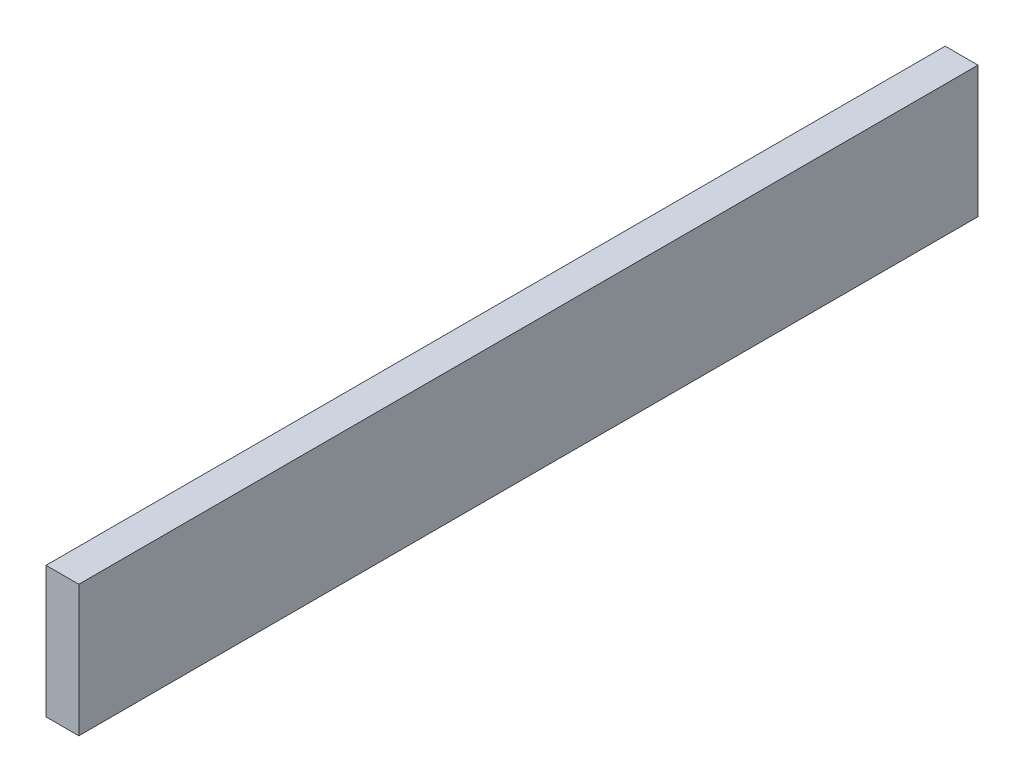
ISO-10303-21;
HEADER;
FILE_DESCRIPTION(('STEP AP214'),'2;1');
FILE_NAME('part.step','',(''),(''),'','','');
FILE_SCHEMA(('AUTOMOTIVE_DESIGN { 1 0 10303 214 1 1 1 1 }'));
ENDSEC;
DATA;
#1=APPLICATION_CONTEXT('core data for automotive mechanical design processes');
#2=APPLICATION_PROTOCOL_DEFINITION('international standard','automotive_design',2000,#1);
#3=PRODUCT_CONTEXT('',#1,'mechanical');
#4=PRODUCT('Part','Part','',(#3));
#5=PRODUCT_RELATED_PRODUCT_CATEGORY('part','',(#4));
#6=PRODUCT_DEFINITION_FORMATION('','',#4);
#7=PRODUCT_DEFINITION_CONTEXT('part definition',#1,'design');
#8=PRODUCT_DEFINITION('design','',#6,#7);
#9=PRODUCT_DEFINITION_SHAPE('','',#8);
#10=(LENGTH_UNIT() NAMED_UNIT(*) SI_UNIT(.MILLI.,.METRE.));
#11=(NAMED_UNIT(*) PLANE_ANGLE_UNIT() SI_UNIT($,.RADIAN.));
#12=(NAMED_UNIT(*) SI_UNIT($,.STERADIAN.) SOLID_ANGLE_UNIT());
#13=UNCERTAINTY_MEASURE_WITH_UNIT(LENGTH_MEASURE(1.E-05),#10,'distance_accuracy_value','');
#14=(GEOMETRIC_REPRESENTATION_CONTEXT(3) GLOBAL_UNCERTAINTY_ASSIGNED_CONTEXT((#13)) GLOBAL_UNIT_ASSIGNED_CONTEXT((#10,
#11,#12)) REPRESENTATION_CONTEXT('',''));
#15=CARTESIAN_POINT('',(0.,0.,0.));
#16=DIRECTION('',(0.,0.,1.));
#17=DIRECTION('',(1.,0.,0.));
#18=AXIS2_PLACEMENT_3D('',#15,#16,#17);
#19=CARTESIAN_POINT('',(0.,0.,173.99));
#20=DIRECTION('',(1.,0.,0.));
#21=DIRECTION('',(0.,0.,-1.));
#22=AXIS2_PLACEMENT_3D('',#19,#20,#21);
#23=PLANE('',#22);
#24=DIRECTION('',(0.,-1.,0.));
#25=VECTOR('',#24,1.);
#26=CARTESIAN_POINT('',(0.,0.,0.));
#27=LINE('',#26,#25);
#28=CARTESIAN_POINT('',(0.,25.4,0.));
#29=VERTEX_POINT('',#28);
#30=CARTESIAN_POINT('',(0.,0.,0.));
#31=VERTEX_POINT('',#30);
#32=EDGE_CURVE('E96',#29,#31,#27,.T.);
#33=ORIENTED_EDGE('',*,*,#32,.T.);
#34=DIRECTION('',(0.,0.,-1.));
#35=VECTOR('',#34,1.);
#36=CARTESIAN_POINT('',(0.,0.,173.99));
#37=LINE('',#36,#35);
#38=CARTESIAN_POINT('',(0.,0.,173.99));
#39=VERTEX_POINT('',#38);
#40=EDGE_CURVE('E11',#39,#31,#37,.T.);
#41=ORIENTED_EDGE('',*,*,#40,.F.);
#42=DIRECTION('',(0.,-1.,0.));
#43=VECTOR('',#42,1.);
#44=CARTESIAN_POINT('',(0.,0.,173.99));
#45=LINE('',#44,#43);
#46=CARTESIAN_POINT('',(0.,25.4,173.99));
#47=VERTEX_POINT('',#46);
#48=EDGE_CURVE('E84',#47,#39,#45,.T.);
#49=ORIENTED_EDGE('',*,*,#48,.F.);
#50=DIRECTION('',(0.,0.,-1.));
#51=VECTOR('',#50,1.);
#52=CARTESIAN_POINT('',(0.,25.4,173.99));
#53=LINE('',#52,#51);
#54=EDGE_CURVE('E92',#47,#29,#53,.T.);
#55=ORIENTED_EDGE('',*,*,#54,.T.);
#56=EDGE_LOOP('',(#33,#41,#49,#55));
#57=FACE_BOUND('',#56,.T.);
#58=ADVANCED_FACE('F33',(#57),#23,.F.);
#59=CARTESIAN_POINT('',(0.,0.,173.99));
#60=DIRECTION('',(0.,1.,0.));
#61=DIRECTION('',(0.,0.,1.));
#62=AXIS2_PLACEMENT_3D('',#59,#60,#61);
#63=PLANE('',#62);
#64=DIRECTION('',(1.,0.,0.));
#65=VECTOR('',#64,1.);
#66=CARTESIAN_POINT('',(0.,0.,0.));
#67=LINE('',#66,#65);
#68=CARTESIAN_POINT('',(6.35,0.,0.));
#69=VERTEX_POINT('',#68);
#70=EDGE_CURVE('E88',#31,#69,#67,.T.);
#71=ORIENTED_EDGE('',*,*,#70,.T.);
#72=DIRECTION('',(0.,0.,-1.));
#73=VECTOR('',#72,1.);
#74=CARTESIAN_POINT('',(6.35,0.,173.99));
#75=LINE('',#74,#73);
#76=CARTESIAN_POINT('',(6.35,0.,173.99));
#77=VERTEX_POINT('',#76);
#78=EDGE_CURVE('E41',#77,#69,#75,.T.);
#79=ORIENTED_EDGE('',*,*,#78,.F.);
#80=DIRECTION('',(1.,0.,0.));
#81=VECTOR('',#80,1.);
#82=CARTESIAN_POINT('',(0.,0.,173.99));
#83=LINE('',#82,#81);
#84=EDGE_CURVE('E79',#39,#77,#83,.T.);
#85=ORIENTED_EDGE('',*,*,#84,.F.);
#86=ORIENTED_EDGE('',*,*,#40,.T.);
#87=EDGE_LOOP('',(#71,#79,#85,#86));
#88=FACE_BOUND('',#87,.T.);
#89=ADVANCED_FACE('F87',(#88),#63,.F.);
#90=CARTESIAN_POINT('',(6.35,0.,173.99));
#91=DIRECTION('',(-1.,0.,0.));
#92=DIRECTION('',(0.,0.,1.));
#93=AXIS2_PLACEMENT_3D('',#90,#91,#92);
#94=PLANE('',#93);
#95=DIRECTION('',(0.,1.,0.));
#96=VECTOR('',#95,1.);
#97=CARTESIAN_POINT('',(6.35,0.,0.));
#98=LINE('',#97,#96);
#99=CARTESIAN_POINT('',(6.35,25.4,0.));
#100=VERTEX_POINT('',#99);
#101=EDGE_CURVE('E66',#69,#100,#98,.T.);
#102=ORIENTED_EDGE('',*,*,#101,.T.);
#103=DIRECTION('',(0.,0.,-1.));
#104=VECTOR('',#103,1.);
#105=CARTESIAN_POINT('',(6.35,25.4,173.99));
#106=LINE('',#105,#104);
#107=CARTESIAN_POINT('',(6.35,25.4,173.99));
#108=VERTEX_POINT('',#107);
#109=EDGE_CURVE('E89',#108,#100,#106,.T.);
#110=ORIENTED_EDGE('',*,*,#109,.F.);
#111=DIRECTION('',(0.,1.,0.));
#112=VECTOR('',#111,1.);
#113=CARTESIAN_POINT('',(6.35,0.,173.99));
#114=LINE('',#113,#112);
#115=EDGE_CURVE('E82',#77,#108,#114,.T.);
#116=ORIENTED_EDGE('',*,*,#115,.F.);
#117=ORIENTED_EDGE('',*,*,#78,.T.);
#118=EDGE_LOOP('',(#102,#110,#116,#117));
#119=FACE_BOUND('',#118,.T.);
#120=ADVANCED_FACE('F90',(#119),#94,.F.);
#121=CARTESIAN_POINT('',(0.,25.4,173.99));
#122=DIRECTION('',(0.,-1.,0.));
#123=DIRECTION('',(0.,0.,-1.));
#124=AXIS2_PLACEMENT_3D('',#121,#122,#123);
#125=PLANE('',#124);
#126=DIRECTION('',(-1.,0.,0.));
#127=VECTOR('',#126,1.);
#128=CARTESIAN_POINT('',(0.,25.4,0.));
#129=LINE('',#128,#127);
#130=EDGE_CURVE('E72',#100,#29,#129,.T.);
#131=ORIENTED_EDGE('',*,*,#130,.T.);
#132=ORIENTED_EDGE('',*,*,#54,.F.);
#133=DIRECTION('',(-1.,0.,0.));
#134=VECTOR('',#133,1.);
#135=CARTESIAN_POINT('',(0.,25.4,173.99));
#136=LINE('',#135,#134);
#137=EDGE_CURVE('E49',#108,#47,#136,.T.);
#138=ORIENTED_EDGE('',*,*,#137,.F.);
#139=ORIENTED_EDGE('',*,*,#109,.T.);
#140=EDGE_LOOP('',(#131,#132,#138,#139));
#141=FACE_BOUND('',#140,.T.);
#142=ADVANCED_FACE('F103',(#141),#125,.F.);
#143=CARTESIAN_POINT('',(0.,0.,173.99));
#144=DIRECTION('',(0.,0.,-1.));
#145=DIRECTION('',(-1.,0.,0.));
#146=AXIS2_PLACEMENT_3D('',#143,#144,#145);
#147=PLANE('',#146);
#148=ORIENTED_EDGE('',*,*,#48,.T.);
#149=ORIENTED_EDGE('',*,*,#84,.T.);
#150=ORIENTED_EDGE('',*,*,#115,.T.);
#151=ORIENTED_EDGE('',*,*,#137,.T.);
#152=EDGE_LOOP('',(#148,#149,#150,#151));
#153=FACE_BOUND('',#152,.T.);
#154=ADVANCED_FACE('F80',(#153),#147,.F.);
#155=CARTESIAN_POINT('',(0.,0.,0.));
#156=DIRECTION('',(0.,0.,-1.));
#157=DIRECTION('',(-1.,0.,0.));
#158=AXIS2_PLACEMENT_3D('',#155,#156,#157);
#159=PLANE('',#158);
#160=ORIENTED_EDGE('',*,*,#32,.F.);
#161=ORIENTED_EDGE('',*,*,#130,.F.);
#162=ORIENTED_EDGE('',*,*,#101,.F.);
#163=ORIENTED_EDGE('',*,*,#70,.F.);
#164=EDGE_LOOP('',(#160,#161,#162,#163));
#165=FACE_BOUND('',#164,.T.);
#166=ADVANCED_FACE('F106',(#165),#159,.T.);
#167=CLOSED_SHELL('',(#58,#89,#120,#142,#154,#166));
#168=MANIFOLD_SOLID_BREP('B2',#167);
#169=ADVANCED_BREP_SHAPE_REPRESENTATION('',(#18,#168),#14);
#170=SHAPE_DEFINITION_REPRESENTATION(#9,#169);
ENDSEC;
END-ISO-10303-21;
